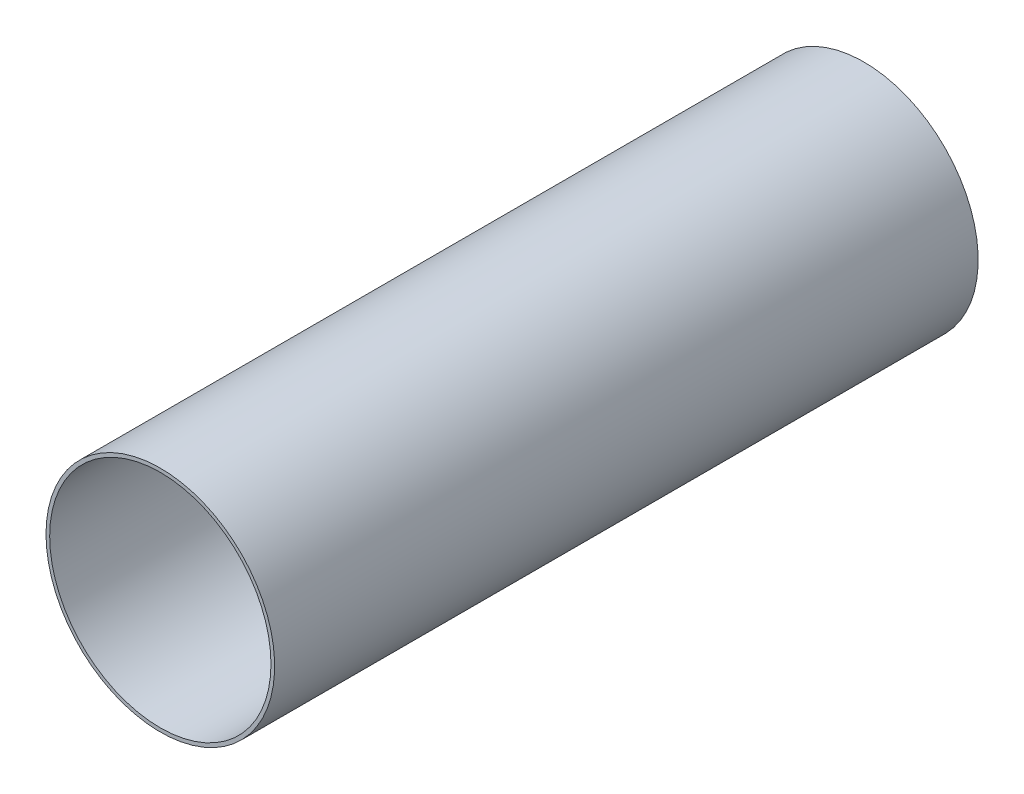
ISO-10303-21;
HEADER;
FILE_DESCRIPTION(('STEP AP214'),'2;1');
FILE_NAME('part.step','',(''),(''),'','','');
FILE_SCHEMA(('AUTOMOTIVE_DESIGN { 1 0 10303 214 1 1 1 1 }'));
ENDSEC;
DATA;
#1=APPLICATION_CONTEXT('core data for automotive mechanical design processes');
#2=APPLICATION_PROTOCOL_DEFINITION('international standard','automotive_design',2000,#1);
#3=PRODUCT_CONTEXT('',#1,'mechanical');
#4=PRODUCT('Part','Part','',(#3));
#5=PRODUCT_RELATED_PRODUCT_CATEGORY('part','',(#4));
#6=PRODUCT_DEFINITION_FORMATION('','',#4);
#7=PRODUCT_DEFINITION_CONTEXT('part definition',#1,'design');
#8=PRODUCT_DEFINITION('design','',#6,#7);
#9=PRODUCT_DEFINITION_SHAPE('','',#8);
#10=(LENGTH_UNIT() NAMED_UNIT(*) SI_UNIT(.MILLI.,.METRE.));
#11=(NAMED_UNIT(*) PLANE_ANGLE_UNIT() SI_UNIT($,.RADIAN.));
#12=(NAMED_UNIT(*) SI_UNIT($,.STERADIAN.) SOLID_ANGLE_UNIT());
#13=UNCERTAINTY_MEASURE_WITH_UNIT(LENGTH_MEASURE(1.E-05),#10,'distance_accuracy_value','');
#14=(GEOMETRIC_REPRESENTATION_CONTEXT(3) GLOBAL_UNCERTAINTY_ASSIGNED_CONTEXT((#13)) GLOBAL_UNIT_ASSIGNED_CONTEXT((#10,
#11,#12)) REPRESENTATION_CONTEXT('',''));
#15=CARTESIAN_POINT('',(0.,0.,0.));
#16=DIRECTION('',(0.,0.,1.));
#17=DIRECTION('',(1.,0.,0.));
#18=AXIS2_PLACEMENT_3D('',#15,#16,#17);
#19=CARTESIAN_POINT('',(0.,0.,304.8));
#20=DIRECTION('',(0.,0.,1.));
#21=DIRECTION('',(1.,0.,0.));
#22=AXIS2_PLACEMENT_3D('',#19,#20,#21);
#23=PLANE('',#22);
#24=CARTESIAN_POINT('',(0.,0.,304.8));
#25=DIRECTION('',(0.,0.,1.));
#26=DIRECTION('',(1.,0.,0.));
#27=AXIS2_PLACEMENT_3D('',#24,#25,#26);
#28=CIRCLE('',#27,49.53);
#29=CARTESIAN_POINT('',(-49.53,0.,304.8));
#30=VERTEX_POINT('',#29);
#31=EDGE_CURVE('E10',#30,#30,#28,.T.);
#32=ORIENTED_EDGE('',*,*,#31,.T.);
#33=EDGE_LOOP('',(#32));
#34=FACE_BOUND('',#33,.T.);
#35=CARTESIAN_POINT('',(0.,0.,304.8));
#36=DIRECTION('',(0.,0.,1.));
#37=DIRECTION('',(1.,0.,0.));
#38=AXIS2_PLACEMENT_3D('',#35,#36,#37);
#39=CIRCLE('',#38,47.9425);
#40=CARTESIAN_POINT('',(-47.9425,0.,304.8));
#41=VERTEX_POINT('',#40);
#42=EDGE_CURVE('E41',#41,#41,#39,.T.);
#43=ORIENTED_EDGE('',*,*,#42,.F.);
#44=EDGE_LOOP('',(#43));
#45=FACE_BOUND('',#44,.T.);
#46=ADVANCED_FACE('F30',(#34,#45),#23,.T.);
#47=CARTESIAN_POINT('',(0.,0.,0.));
#48=DIRECTION('',(0.,0.,1.));
#49=DIRECTION('',(1.,0.,0.));
#50=AXIS2_PLACEMENT_3D('',#47,#48,#49);
#51=PLANE('',#50);
#52=CARTESIAN_POINT('',(0.,0.,0.));
#53=DIRECTION('',(0.,0.,1.));
#54=DIRECTION('',(1.,0.,0.));
#55=AXIS2_PLACEMENT_3D('',#52,#53,#54);
#56=CIRCLE('',#55,49.53);
#57=CARTESIAN_POINT('',(-49.53,0.,0.));
#58=VERTEX_POINT('',#57);
#59=EDGE_CURVE('E34',#58,#58,#56,.T.);
#60=ORIENTED_EDGE('',*,*,#59,.F.);
#61=EDGE_LOOP('',(#60));
#62=FACE_BOUND('',#61,.T.);
#63=CARTESIAN_POINT('',(0.,0.,0.));
#64=DIRECTION('',(0.,0.,1.));
#65=DIRECTION('',(1.,0.,0.));
#66=AXIS2_PLACEMENT_3D('',#63,#64,#65);
#67=CIRCLE('',#66,47.9425);
#68=CARTESIAN_POINT('',(-47.9425,0.,0.));
#69=VERTEX_POINT('',#68);
#70=EDGE_CURVE('E43',#69,#69,#67,.T.);
#71=ORIENTED_EDGE('',*,*,#70,.T.);
#72=EDGE_LOOP('',(#71));
#73=FACE_BOUND('',#72,.T.);
#74=ADVANCED_FACE('F53',(#62,#73),#51,.F.);
#75=CARTESIAN_POINT('',(0.,0.,304.8));
#76=DIRECTION('',(0.,0.,-1.));
#77=DIRECTION('',(-1.,0.,0.));
#78=AXIS2_PLACEMENT_3D('',#75,#76,#77);
#79=CYLINDRICAL_SURFACE('',#78,49.53);
#80=CARTESIAN_POINT('',(-49.53,0.,304.8));
#81=CARTESIAN_POINT('',(-49.53,0.,301.625));
#82=CARTESIAN_POINT('',(-49.53,0.,298.45));
#83=CARTESIAN_POINT('',(-49.53,0.,292.1));
#84=CARTESIAN_POINT('',(-49.53,0.,288.925));
#85=CARTESIAN_POINT('',(-49.53,0.,282.575));
#86=CARTESIAN_POINT('',(-49.53,0.,279.4));
#87=CARTESIAN_POINT('',(-49.53,0.,273.05));
#88=CARTESIAN_POINT('',(-49.53,0.,269.875));
#89=CARTESIAN_POINT('',(-49.53,0.,263.525));
#90=CARTESIAN_POINT('',(-49.53,0.,260.35));
#91=CARTESIAN_POINT('',(-49.53,0.,254.));
#92=CARTESIAN_POINT('',(-49.53,0.,250.825));
#93=CARTESIAN_POINT('',(-49.53,0.,244.475));
#94=CARTESIAN_POINT('',(-49.53,0.,241.3));
#95=CARTESIAN_POINT('',(-49.53,0.,234.95));
#96=CARTESIAN_POINT('',(-49.53,0.,231.775));
#97=CARTESIAN_POINT('',(-49.53,0.,225.425));
#98=CARTESIAN_POINT('',(-49.53,0.,222.25));
#99=CARTESIAN_POINT('',(-49.53,0.,215.9));
#100=CARTESIAN_POINT('',(-49.53,0.,212.725));
#101=CARTESIAN_POINT('',(-49.53,0.,206.375));
#102=CARTESIAN_POINT('',(-49.53,0.,203.2));
#103=CARTESIAN_POINT('',(-49.53,0.,196.85));
#104=CARTESIAN_POINT('',(-49.53,0.,193.675));
#105=CARTESIAN_POINT('',(-49.53,0.,187.325));
#106=CARTESIAN_POINT('',(-49.53,0.,184.15));
#107=CARTESIAN_POINT('',(-49.53,0.,177.8));
#108=CARTESIAN_POINT('',(-49.53,0.,174.625));
#109=CARTESIAN_POINT('',(-49.53,0.,168.275));
#110=CARTESIAN_POINT('',(-49.53,0.,165.1));
#111=CARTESIAN_POINT('',(-49.53,0.,158.75));
#112=CARTESIAN_POINT('',(-49.53,0.,155.575));
#113=CARTESIAN_POINT('',(-49.53,0.,149.225));
#114=CARTESIAN_POINT('',(-49.53,0.,146.05));
#115=CARTESIAN_POINT('',(-49.53,0.,139.7));
#116=CARTESIAN_POINT('',(-49.53,0.,136.525));
#117=CARTESIAN_POINT('',(-49.53,0.,130.175));
#118=CARTESIAN_POINT('',(-49.53,0.,127.));
#119=CARTESIAN_POINT('',(-49.53,0.,120.65));
#120=CARTESIAN_POINT('',(-49.53,0.,117.475));
#121=CARTESIAN_POINT('',(-49.53,0.,111.125));
#122=CARTESIAN_POINT('',(-49.53,0.,107.95));
#123=CARTESIAN_POINT('',(-49.53,0.,101.6));
#124=CARTESIAN_POINT('',(-49.53,0.,98.425));
#125=CARTESIAN_POINT('',(-49.53,0.,92.075));
#126=CARTESIAN_POINT('',(-49.53,0.,88.9));
#127=CARTESIAN_POINT('',(-49.53,0.,82.55));
#128=CARTESIAN_POINT('',(-49.53,0.,79.375));
#129=CARTESIAN_POINT('',(-49.53,0.,73.025));
#130=CARTESIAN_POINT('',(-49.53,0.,69.85));
#131=CARTESIAN_POINT('',(-49.53,0.,63.5));
#132=CARTESIAN_POINT('',(-49.53,0.,60.325));
#133=CARTESIAN_POINT('',(-49.53,0.,53.975));
#134=CARTESIAN_POINT('',(-49.53,0.,50.8));
#135=CARTESIAN_POINT('',(-49.53,0.,44.45));
#136=CARTESIAN_POINT('',(-49.53,0.,41.275));
#137=CARTESIAN_POINT('',(-49.53,0.,34.925));
#138=CARTESIAN_POINT('',(-49.53,0.,31.75));
#139=CARTESIAN_POINT('',(-49.53,0.,25.4));
#140=CARTESIAN_POINT('',(-49.53,0.,22.225));
#141=CARTESIAN_POINT('',(-49.53,0.,15.875));
#142=CARTESIAN_POINT('',(-49.53,0.,12.7));
#143=CARTESIAN_POINT('',(-49.53,0.,6.35));
#144=CARTESIAN_POINT('',(-49.53,0.,3.175));
#145=CARTESIAN_POINT('',(-49.53,0.,0.));
#146=B_SPLINE_CURVE_WITH_KNOTS('',3,(#80,#81,#82,#83,#84,#85,#86,#87,#88,#89,#90,#91,#92,#93,
#94,#95,#96,#97,#98,#99,#100,#101,#102,#103,#104,#105,#106,#107,#108,#109,#110,#111,#112,#113,
#114,#115,#116,#117,#118,#119,#120,#121,#122,#123,#124,#125,#126,#127,#128,#129,#130,#131,#132,
#133,#134,#135,#136,#137,#138,#139,#140,#141,#142,#143,#144,#145),.UNSPECIFIED.,.F.,.F.,(4,2,2,
2,2,2,2,2,2,2,2,2,2,2,2,2,2,2,2,2,2,2,2,2,2,2,2,2,2,2,2,2,4),(0.,9.52499999999995,19.05,28.575,
38.1,47.625,57.15,66.675,76.2,85.725,95.2499999999999,104.775,114.3,123.825,133.35,142.875,
152.4,161.925,171.45,180.975,190.5,200.025,209.55,219.075,228.6,238.125,247.65,257.175,266.7,
276.225,285.75,295.275,304.8),.UNSPECIFIED.);
#147=EDGE_CURVE('BSEAM32',#30,#58,#146,.T.);
#148=ORIENTED_EDGE('',*,*,#31,.F.);
#149=ORIENTED_EDGE('',*,*,#59,.T.);
#150=ORIENTED_EDGE('',*,*,#147,.T.);
#151=ORIENTED_EDGE('',*,*,#147,.F.);
#152=EDGE_LOOP('',(#148,#150,#149,#151));
#153=FACE_BOUND('',#152,.T.);
#154=ADVANCED_FACE('F32',(#153),#79,.T.);
#155=CARTESIAN_POINT('',(0.,0.,304.8));
#156=DIRECTION('',(0.,0.,-1.));
#157=DIRECTION('',(-1.,0.,0.));
#158=AXIS2_PLACEMENT_3D('',#155,#156,#157);
#159=CYLINDRICAL_SURFACE('',#158,47.9425);
#160=CARTESIAN_POINT('',(-47.9425,0.,304.8));
#161=CARTESIAN_POINT('',(-47.9425,0.,301.625));
#162=CARTESIAN_POINT('',(-47.9425,0.,298.45));
#163=CARTESIAN_POINT('',(-47.9425,0.,292.1));
#164=CARTESIAN_POINT('',(-47.9425,0.,288.925));
#165=CARTESIAN_POINT('',(-47.9425,0.,282.575));
#166=CARTESIAN_POINT('',(-47.9425,0.,279.4));
#167=CARTESIAN_POINT('',(-47.9425,0.,273.05));
#168=CARTESIAN_POINT('',(-47.9425,0.,269.875));
#169=CARTESIAN_POINT('',(-47.9425,0.,263.525));
#170=CARTESIAN_POINT('',(-47.9425,0.,260.35));
#171=CARTESIAN_POINT('',(-47.9425,0.,254.));
#172=CARTESIAN_POINT('',(-47.9425,0.,250.825));
#173=CARTESIAN_POINT('',(-47.9425,0.,244.475));
#174=CARTESIAN_POINT('',(-47.9425,0.,241.3));
#175=CARTESIAN_POINT('',(-47.9425,0.,234.95));
#176=CARTESIAN_POINT('',(-47.9425,0.,231.775));
#177=CARTESIAN_POINT('',(-47.9425,0.,225.425));
#178=CARTESIAN_POINT('',(-47.9425,0.,222.25));
#179=CARTESIAN_POINT('',(-47.9425,0.,215.9));
#180=CARTESIAN_POINT('',(-47.9425,0.,212.725));
#181=CARTESIAN_POINT('',(-47.9425,0.,206.375));
#182=CARTESIAN_POINT('',(-47.9425,0.,203.2));
#183=CARTESIAN_POINT('',(-47.9425,0.,196.85));
#184=CARTESIAN_POINT('',(-47.9425,0.,193.675));
#185=CARTESIAN_POINT('',(-47.9425,0.,187.325));
#186=CARTESIAN_POINT('',(-47.9425,0.,184.15));
#187=CARTESIAN_POINT('',(-47.9425,0.,177.8));
#188=CARTESIAN_POINT('',(-47.9425,0.,174.625));
#189=CARTESIAN_POINT('',(-47.9425,0.,168.275));
#190=CARTESIAN_POINT('',(-47.9425,0.,165.1));
#191=CARTESIAN_POINT('',(-47.9425,0.,158.75));
#192=CARTESIAN_POINT('',(-47.9425,0.,155.575));
#193=CARTESIAN_POINT('',(-47.9425,0.,149.225));
#194=CARTESIAN_POINT('',(-47.9425,0.,146.05));
#195=CARTESIAN_POINT('',(-47.9425,0.,139.7));
#196=CARTESIAN_POINT('',(-47.9425,0.,136.525));
#197=CARTESIAN_POINT('',(-47.9425,0.,130.175));
#198=CARTESIAN_POINT('',(-47.9425,0.,127.));
#199=CARTESIAN_POINT('',(-47.9425,0.,120.65));
#200=CARTESIAN_POINT('',(-47.9425,0.,117.475));
#201=CARTESIAN_POINT('',(-47.9425,0.,111.125));
#202=CARTESIAN_POINT('',(-47.9425,0.,107.95));
#203=CARTESIAN_POINT('',(-47.9425,0.,101.6));
#204=CARTESIAN_POINT('',(-47.9425,0.,98.425));
#205=CARTESIAN_POINT('',(-47.9425,0.,92.075));
#206=CARTESIAN_POINT('',(-47.9425,0.,88.9));
#207=CARTESIAN_POINT('',(-47.9425,0.,82.55));
#208=CARTESIAN_POINT('',(-47.9425,0.,79.375));
#209=CARTESIAN_POINT('',(-47.9425,0.,73.025));
#210=CARTESIAN_POINT('',(-47.9425,0.,69.85));
#211=CARTESIAN_POINT('',(-47.9425,0.,63.5));
#212=CARTESIAN_POINT('',(-47.9425,0.,60.325));
#213=CARTESIAN_POINT('',(-47.9425,0.,53.975));
#214=CARTESIAN_POINT('',(-47.9425,0.,50.8));
#215=CARTESIAN_POINT('',(-47.9425,0.,44.45));
#216=CARTESIAN_POINT('',(-47.9425,0.,41.275));
#217=CARTESIAN_POINT('',(-47.9425,0.,34.925));
#218=CARTESIAN_POINT('',(-47.9425,0.,31.75));
#219=CARTESIAN_POINT('',(-47.9425,0.,25.4));
#220=CARTESIAN_POINT('',(-47.9425,0.,22.225));
#221=CARTESIAN_POINT('',(-47.9425,0.,15.875));
#222=CARTESIAN_POINT('',(-47.9425,0.,12.7));
#223=CARTESIAN_POINT('',(-47.9425,0.,6.35));
#224=CARTESIAN_POINT('',(-47.9425,0.,3.175));
#225=CARTESIAN_POINT('',(-47.9425,0.,0.));
#226=B_SPLINE_CURVE_WITH_KNOTS('',3,(#160,#161,#162,#163,#164,#165,#166,#167,#168,#169,#170,
#171,#172,#173,#174,#175,#176,#177,#178,#179,#180,#181,#182,#183,#184,#185,#186,#187,#188,#189,
#190,#191,#192,#193,#194,#195,#196,#197,#198,#199,#200,#201,#202,#203,#204,#205,#206,#207,#208,
#209,#210,#211,#212,#213,#214,#215,#216,#217,#218,#219,#220,#221,#222,#223,#224,#225),
.UNSPECIFIED.,.F.,.F.,(4,2,2,2,2,2,2,2,2,2,2,2,2,2,2,2,2,2,2,2,2,2,2,2,2,2,2,2,2,2,2,2,4),(0.,
9.52500000000001,19.05,28.575,38.1,47.625,57.15,66.675,76.2,85.7250000000001,95.2500000000001,
104.775,114.3,123.825,133.35,142.875,152.4,161.925,171.45,180.975,190.5,200.025,209.55,219.075,
228.6,238.125,247.65,257.175,266.7,276.225,285.75,295.275,304.8),.UNSPECIFIED.);
#227=EDGE_CURVE('BSEAM49',#41,#69,#226,.T.);
#228=ORIENTED_EDGE('',*,*,#42,.T.);
#229=ORIENTED_EDGE('',*,*,#70,.F.);
#230=ORIENTED_EDGE('',*,*,#227,.T.);
#231=ORIENTED_EDGE('',*,*,#227,.F.);
#232=EDGE_LOOP('',(#228,#230,#229,#231));
#233=FACE_BOUND('',#232,.T.);
#234=ADVANCED_FACE('F49',(#233),#159,.F.);
#235=CLOSED_SHELL('',(#46,#74,#154,#234));
#236=MANIFOLD_SOLID_BREP('B2',#235);
#237=ADVANCED_BREP_SHAPE_REPRESENTATION('',(#18,#236),#14);
#238=SHAPE_DEFINITION_REPRESENTATION(#9,#237);
ENDSEC;
END-ISO-10303-21;
